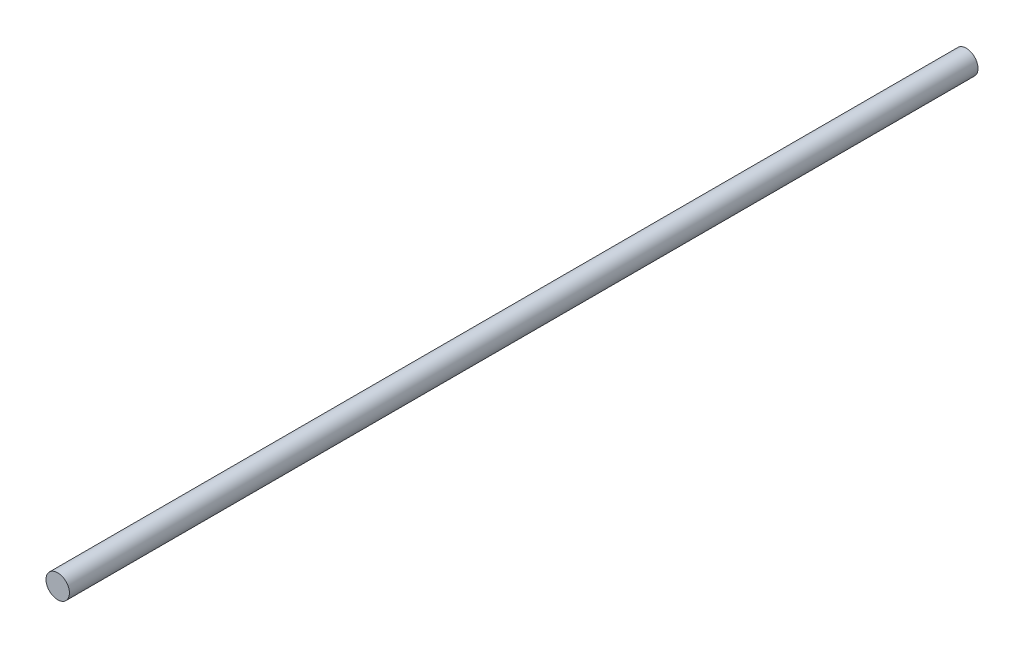
ISO-10303-21;
HEADER;
FILE_DESCRIPTION(('STEP AP214'),'2;1');
FILE_NAME('part.step','',(''),(''),'','','');
FILE_SCHEMA(('AUTOMOTIVE_DESIGN { 1 0 10303 214 1 1 1 1 }'));
ENDSEC;
DATA;
#1=APPLICATION_CONTEXT('core data for automotive mechanical design processes');
#2=APPLICATION_PROTOCOL_DEFINITION('international standard','automotive_design',2000,#1);
#3=PRODUCT_CONTEXT('',#1,'mechanical');
#4=PRODUCT('Part','Part','',(#3));
#5=PRODUCT_RELATED_PRODUCT_CATEGORY('part','',(#4));
#6=PRODUCT_DEFINITION_FORMATION('','',#4);
#7=PRODUCT_DEFINITION_CONTEXT('part definition',#1,'design');
#8=PRODUCT_DEFINITION('design','',#6,#7);
#9=PRODUCT_DEFINITION_SHAPE('','',#8);
#10=(LENGTH_UNIT() NAMED_UNIT(*) SI_UNIT(.MILLI.,.METRE.));
#11=(NAMED_UNIT(*) PLANE_ANGLE_UNIT() SI_UNIT($,.RADIAN.));
#12=(NAMED_UNIT(*) SI_UNIT($,.STERADIAN.) SOLID_ANGLE_UNIT());
#13=UNCERTAINTY_MEASURE_WITH_UNIT(LENGTH_MEASURE(1.E-05),#10,'distance_accuracy_value','');
#14=(GEOMETRIC_REPRESENTATION_CONTEXT(3) GLOBAL_UNCERTAINTY_ASSIGNED_CONTEXT((#13)) GLOBAL_UNIT_ASSIGNED_CONTEXT((#10,
#11,#12)) REPRESENTATION_CONTEXT('',''));
#15=CARTESIAN_POINT('',(0.,0.,0.));
#16=DIRECTION('',(0.,0.,1.));
#17=DIRECTION('',(1.,0.,0.));
#18=AXIS2_PLACEMENT_3D('',#15,#16,#17);
#19=CARTESIAN_POINT('',(0.,0.,310.));
#20=DIRECTION('',(0.,0.,-1.));
#21=DIRECTION('',(-1.,0.,0.));
#22=AXIS2_PLACEMENT_3D('',#19,#20,#21);
#23=CYLINDRICAL_SURFACE('',#22,4.);
#24=CARTESIAN_POINT('',(0.,0.,310.));
#25=DIRECTION('',(0.,0.,1.));
#26=DIRECTION('',(1.,0.,0.));
#27=AXIS2_PLACEMENT_3D('',#24,#25,#26);
#28=CIRCLE('',#27,4.);
#29=CARTESIAN_POINT('',(4.,0.,310.));
#30=VERTEX_POINT('',#29);
#31=EDGE_CURVE('E10',#30,#30,#28,.T.);
#32=ORIENTED_EDGE('',*,*,#31,.F.);
#33=EDGE_LOOP('',(#32));
#34=FACE_BOUND('',#33,.T.);
#35=CARTESIAN_POINT('',(0.,0.,0.));
#36=DIRECTION('',(0.,0.,1.));
#37=DIRECTION('',(1.,0.,0.));
#38=AXIS2_PLACEMENT_3D('',#35,#36,#37);
#39=CIRCLE('',#38,4.);
#40=CARTESIAN_POINT('',(4.,0.,0.));
#41=VERTEX_POINT('',#40);
#42=EDGE_CURVE('E33',#41,#41,#39,.T.);
#43=ORIENTED_EDGE('',*,*,#42,.T.);
#44=EDGE_LOOP('',(#43));
#45=FACE_BOUND('',#44,.T.);
#46=ADVANCED_FACE('F30',(#34,#45),#23,.T.);
#47=CARTESIAN_POINT('',(0.,0.,310.));
#48=DIRECTION('',(0.,0.,1.));
#49=DIRECTION('',(1.,0.,0.));
#50=AXIS2_PLACEMENT_3D('',#47,#48,#49);
#51=PLANE('',#50);
#52=ORIENTED_EDGE('',*,*,#31,.T.);
#53=EDGE_LOOP('',(#52));
#54=FACE_BOUND('',#53,.T.);
#55=ADVANCED_FACE('F45',(#54),#51,.T.);
#56=CARTESIAN_POINT('',(0.,0.,0.));
#57=DIRECTION('',(0.,0.,1.));
#58=DIRECTION('',(1.,0.,0.));
#59=AXIS2_PLACEMENT_3D('',#56,#57,#58);
#60=PLANE('',#59);
#61=ORIENTED_EDGE('',*,*,#42,.F.);
#62=EDGE_LOOP('',(#61));
#63=FACE_BOUND('',#62,.T.);
#64=ADVANCED_FACE('F43',(#63),#60,.F.);
#65=CLOSED_SHELL('',(#46,#55,#64));
#66=MANIFOLD_SOLID_BREP('B2',#65);
#67=ADVANCED_BREP_SHAPE_REPRESENTATION('',(#18,#66),#14);
#68=SHAPE_DEFINITION_REPRESENTATION(#9,#67);
ENDSEC;
END-ISO-10303-21;
